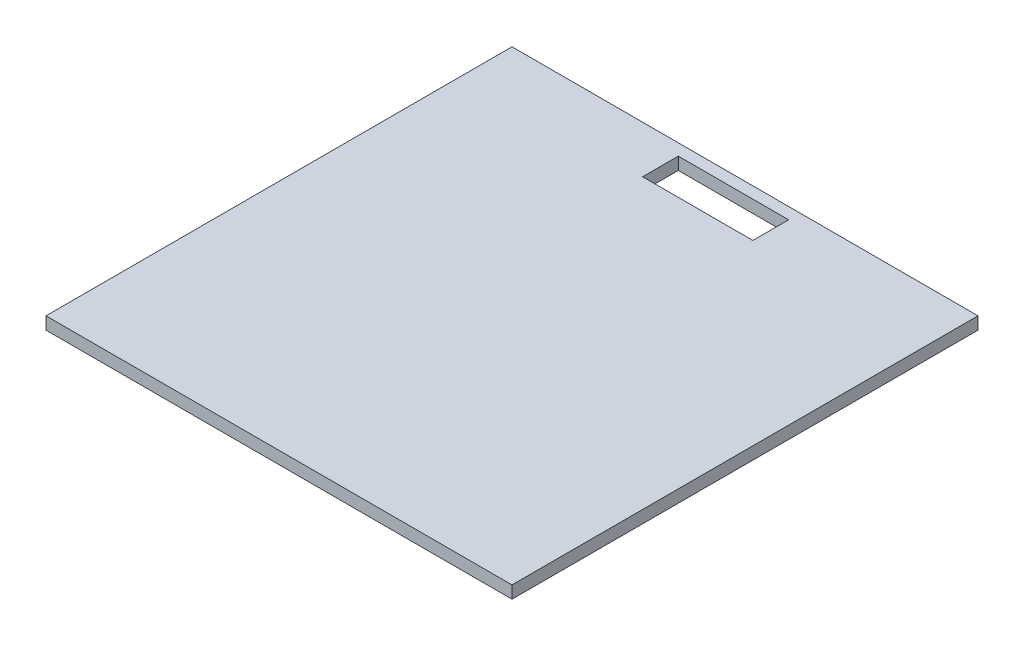
ISO-10303-21;
HEADER;
FILE_DESCRIPTION(('STEP AP214'),'2;1');
FILE_NAME('part.step','',(''),(''),'','','');
FILE_SCHEMA(('AUTOMOTIVE_DESIGN { 1 0 10303 214 1 1 1 1 }'));
ENDSEC;
DATA;
#1=APPLICATION_CONTEXT('core data for automotive mechanical design processes');
#2=APPLICATION_PROTOCOL_DEFINITION('international standard','automotive_design',2000,#1);
#3=PRODUCT_CONTEXT('',#1,'mechanical');
#4=PRODUCT('Part','Part','',(#3));
#5=PRODUCT_RELATED_PRODUCT_CATEGORY('part','',(#4));
#6=PRODUCT_DEFINITION_FORMATION('','',#4);
#7=PRODUCT_DEFINITION_CONTEXT('part definition',#1,'design');
#8=PRODUCT_DEFINITION('design','',#6,#7);
#9=PRODUCT_DEFINITION_SHAPE('','',#8);
#10=(LENGTH_UNIT() NAMED_UNIT(*) SI_UNIT(.MILLI.,.METRE.));
#11=(NAMED_UNIT(*) PLANE_ANGLE_UNIT() SI_UNIT($,.RADIAN.));
#12=(NAMED_UNIT(*) SI_UNIT($,.STERADIAN.) SOLID_ANGLE_UNIT());
#13=UNCERTAINTY_MEASURE_WITH_UNIT(LENGTH_MEASURE(1.E-05),#10,'distance_accuracy_value','');
#14=(GEOMETRIC_REPRESENTATION_CONTEXT(3) GLOBAL_UNCERTAINTY_ASSIGNED_CONTEXT((#13)) GLOBAL_UNIT_ASSIGNED_CONTEXT((#10,
#11,#12)) REPRESENTATION_CONTEXT('',''));
#15=CARTESIAN_POINT('',(0.,0.,0.));
#16=DIRECTION('',(0.,0.,1.));
#17=DIRECTION('',(1.,0.,0.));
#18=AXIS2_PLACEMENT_3D('',#15,#16,#17);
#19=CARTESIAN_POINT('',(0.,0.,0.));
#20=DIRECTION('',(0.,1.,0.));
#21=DIRECTION('',(0.,0.,1.));
#22=AXIS2_PLACEMENT_3D('',#19,#20,#21);
#23=PLANE('',#22);
#24=DIRECTION('',(0.,0.,-1.));
#25=VECTOR('',#24,1.);
#26=CARTESIAN_POINT('',(150.,0.,-150.));
#27=LINE('',#26,#25);
#28=CARTESIAN_POINT('',(150.,0.,150.));
#29=VERTEX_POINT('',#28);
#30=CARTESIAN_POINT('',(150.,0.,-150.));
#31=VERTEX_POINT('',#30);
#32=EDGE_CURVE('E125',#29,#31,#27,.T.);
#33=ORIENTED_EDGE('',*,*,#32,.F.);
#34=DIRECTION('',(1.,0.,0.));
#35=VECTOR('',#34,1.);
#36=CARTESIAN_POINT('',(-150.,0.,150.));
#37=LINE('',#36,#35);
#38=CARTESIAN_POINT('',(-150.,0.,150.));
#39=VERTEX_POINT('',#38);
#40=EDGE_CURVE('E73',#39,#29,#37,.T.);
#41=ORIENTED_EDGE('',*,*,#40,.F.);
#42=DIRECTION('',(0.,0.,1.));
#43=VECTOR('',#42,1.);
#44=CARTESIAN_POINT('',(-150.,0.,-150.));
#45=LINE('',#44,#43);
#46=CARTESIAN_POINT('',(-150.,0.,-150.));
#47=VERTEX_POINT('',#46);
#48=EDGE_CURVE('E175',#47,#39,#45,.T.);
#49=ORIENTED_EDGE('',*,*,#48,.F.);
#50=DIRECTION('',(-1.,0.,0.));
#51=VECTOR('',#50,1.);
#52=CARTESIAN_POINT('',(-150.,0.,-150.));
#53=LINE('',#52,#51);
#54=EDGE_CURVE('E180',#31,#47,#53,.T.);
#55=ORIENTED_EDGE('',*,*,#54,.F.);
#56=EDGE_LOOP('',(#33,#41,#49,#55));
#57=FACE_BOUND('',#56,.T.);
#58=DIRECTION('',(0.,0.,-1.));
#59=VECTOR('',#58,1.);
#60=CARTESIAN_POINT('',(35.5000000000001,0.,-142.565800102706));
#61=LINE('',#60,#59);
#62=CARTESIAN_POINT('',(35.5000000000001,0.,-119.565800102706));
#63=VERTEX_POINT('',#62);
#64=CARTESIAN_POINT('',(35.5000000000001,0.,-142.565800102706));
#65=VERTEX_POINT('',#64);
#66=EDGE_CURVE('E65',#63,#65,#61,.T.);
#67=ORIENTED_EDGE('',*,*,#66,.T.);
#68=DIRECTION('',(-1.,0.,0.));
#69=VECTOR('',#68,1.);
#70=CARTESIAN_POINT('',(-35.4999999999999,0.,-142.565800102706));
#71=LINE('',#70,#69);
#72=CARTESIAN_POINT('',(-35.4999999999999,0.,-142.565800102706));
#73=VERTEX_POINT('',#72);
#74=EDGE_CURVE('E123',#65,#73,#71,.T.);
#75=ORIENTED_EDGE('',*,*,#74,.T.);
#76=DIRECTION('',(0.,0.,1.));
#77=VECTOR('',#76,1.);
#78=CARTESIAN_POINT('',(-35.4999999999999,0.,-142.565800102706));
#79=LINE('',#78,#77);
#80=CARTESIAN_POINT('',(-35.4999999999999,0.,-119.565800102706));
#81=VERTEX_POINT('',#80);
#82=EDGE_CURVE('E216',#73,#81,#79,.T.);
#83=ORIENTED_EDGE('',*,*,#82,.T.);
#84=DIRECTION('',(1.,0.,0.));
#85=VECTOR('',#84,1.);
#86=CARTESIAN_POINT('',(-35.4999999999999,0.,-119.565800102706));
#87=LINE('',#86,#85);
#88=EDGE_CURVE('E212',#81,#63,#87,.T.);
#89=ORIENTED_EDGE('',*,*,#88,.T.);
#90=EDGE_LOOP('',(#67,#75,#83,#89));
#91=FACE_BOUND('',#90,.T.);
#92=ADVANCED_FACE('F49',(#57,#91),#23,.F.);
#93=CARTESIAN_POINT('',(150.,0.2,-150.));
#94=DIRECTION('',(-1.,0.,0.));
#95=DIRECTION('',(0.,0.,1.));
#96=AXIS2_PLACEMENT_3D('',#93,#94,#95);
#97=PLANE('',#96);
#98=ORIENTED_EDGE('',*,*,#32,.T.);
#99=DIRECTION('',(0.,-1.,0.));
#100=VECTOR('',#99,1.);
#101=CARTESIAN_POINT('',(150.,0.2,-150.));
#102=LINE('',#101,#100);
#103=CARTESIAN_POINT('',(150.,8.,-150.));
#104=VERTEX_POINT('',#103);
#105=EDGE_CURVE('E12',#104,#31,#102,.T.);
#106=ORIENTED_EDGE('',*,*,#105,.F.);
#107=DIRECTION('',(0.,0.,-1.));
#108=VECTOR('',#107,1.);
#109=CARTESIAN_POINT('',(150.,8.,-150.));
#110=LINE('',#109,#108);
#111=CARTESIAN_POINT('',(150.,8.,150.));
#112=VERTEX_POINT('',#111);
#113=EDGE_CURVE('E161',#112,#104,#110,.T.);
#114=ORIENTED_EDGE('',*,*,#113,.F.);
#115=DIRECTION('',(0.,-1.,0.));
#116=VECTOR('',#115,1.);
#117=CARTESIAN_POINT('',(150.,0.2,150.));
#118=LINE('',#117,#116);
#119=EDGE_CURVE('E183',#112,#29,#118,.T.);
#120=ORIENTED_EDGE('',*,*,#119,.T.);
#121=EDGE_LOOP('',(#98,#106,#114,#120));
#122=FACE_BOUND('',#121,.T.);
#123=ADVANCED_FACE('F51',(#122),#97,.F.);
#124=CARTESIAN_POINT('',(-150.,0.2,-150.));
#125=DIRECTION('',(0.,0.,1.));
#126=DIRECTION('',(1.,0.,0.));
#127=AXIS2_PLACEMENT_3D('',#124,#125,#126);
#128=PLANE('',#127);
#129=ORIENTED_EDGE('',*,*,#54,.T.);
#130=DIRECTION('',(0.,-1.,0.));
#131=VECTOR('',#130,1.);
#132=CARTESIAN_POINT('',(-150.,0.2,-150.));
#133=LINE('',#132,#131);
#134=CARTESIAN_POINT('',(-150.,8.,-150.));
#135=VERTEX_POINT('',#134);
#136=EDGE_CURVE('E58',#135,#47,#133,.T.);
#137=ORIENTED_EDGE('',*,*,#136,.F.);
#138=DIRECTION('',(-1.,0.,0.));
#139=VECTOR('',#138,1.);
#140=CARTESIAN_POINT('',(-150.,8.,-150.));
#141=LINE('',#140,#139);
#142=EDGE_CURVE('E154',#104,#135,#141,.T.);
#143=ORIENTED_EDGE('',*,*,#142,.F.);
#144=ORIENTED_EDGE('',*,*,#105,.T.);
#145=EDGE_LOOP('',(#129,#137,#143,#144));
#146=FACE_BOUND('',#145,.T.);
#147=ADVANCED_FACE('F242',(#146),#128,.F.);
#148=CARTESIAN_POINT('',(-150.,0.2,-150.));
#149=DIRECTION('',(1.,0.,0.));
#150=DIRECTION('',(0.,0.,-1.));
#151=AXIS2_PLACEMENT_3D('',#148,#149,#150);
#152=PLANE('',#151);
#153=ORIENTED_EDGE('',*,*,#48,.T.);
#154=DIRECTION('',(0.,-1.,0.));
#155=VECTOR('',#154,1.);
#156=CARTESIAN_POINT('',(-150.,0.2,150.));
#157=LINE('',#156,#155);
#158=CARTESIAN_POINT('',(-150.,8.,150.));
#159=VERTEX_POINT('',#158);
#160=EDGE_CURVE('E186',#159,#39,#157,.T.);
#161=ORIENTED_EDGE('',*,*,#160,.F.);
#162=DIRECTION('',(0.,0.,1.));
#163=VECTOR('',#162,1.);
#164=CARTESIAN_POINT('',(-150.,8.,-150.));
#165=LINE('',#164,#163);
#166=EDGE_CURVE('E160',#135,#159,#165,.T.);
#167=ORIENTED_EDGE('',*,*,#166,.F.);
#168=ORIENTED_EDGE('',*,*,#136,.T.);
#169=EDGE_LOOP('',(#153,#161,#167,#168));
#170=FACE_BOUND('',#169,.T.);
#171=ADVANCED_FACE('F193',(#170),#152,.F.);
#172=CARTESIAN_POINT('',(-150.,0.2,150.));
#173=DIRECTION('',(0.,0.,-1.));
#174=DIRECTION('',(-1.,0.,0.));
#175=AXIS2_PLACEMENT_3D('',#172,#173,#174);
#176=PLANE('',#175);
#177=ORIENTED_EDGE('',*,*,#40,.T.);
#178=ORIENTED_EDGE('',*,*,#119,.F.);
#179=DIRECTION('',(1.,0.,0.));
#180=VECTOR('',#179,1.);
#181=CARTESIAN_POINT('',(-150.,8.,150.));
#182=LINE('',#181,#180);
#183=EDGE_CURVE('E166',#159,#112,#182,.T.);
#184=ORIENTED_EDGE('',*,*,#183,.F.);
#185=ORIENTED_EDGE('',*,*,#160,.T.);
#186=EDGE_LOOP('',(#177,#178,#184,#185));
#187=FACE_BOUND('',#186,.T.);
#188=ADVANCED_FACE('F246',(#187),#176,.F.);
#189=CARTESIAN_POINT('',(35.5000000000001,0.2,-142.565800102706));
#190=DIRECTION('',(-1.,0.,0.));
#191=DIRECTION('',(0.,0.,1.));
#192=AXIS2_PLACEMENT_3D('',#189,#190,#191);
#193=PLANE('',#192);
#194=ORIENTED_EDGE('',*,*,#66,.F.);
#195=DIRECTION('',(0.,-1.,0.));
#196=VECTOR('',#195,1.);
#197=CARTESIAN_POINT('',(35.5000000000001,0.2,-119.565800102706));
#198=LINE('',#197,#196);
#199=CARTESIAN_POINT('',(35.5000000000001,8.,-119.565800102706));
#200=VERTEX_POINT('',#199);
#201=EDGE_CURVE('E131',#200,#63,#198,.T.);
#202=ORIENTED_EDGE('',*,*,#201,.F.);
#203=DIRECTION('',(0.,0.,-1.));
#204=VECTOR('',#203,1.);
#205=CARTESIAN_POINT('',(35.5000000000001,8.,-142.565800102706));
#206=LINE('',#205,#204);
#207=CARTESIAN_POINT('',(35.5000000000001,8.,-142.565800102706));
#208=VERTEX_POINT('',#207);
#209=EDGE_CURVE('E129',#200,#208,#206,.T.);
#210=ORIENTED_EDGE('',*,*,#209,.T.);
#211=DIRECTION('',(0.,-1.,0.));
#212=VECTOR('',#211,1.);
#213=CARTESIAN_POINT('',(35.5000000000001,0.2,-142.565800102706));
#214=LINE('',#213,#212);
#215=EDGE_CURVE('E116',#208,#65,#214,.T.);
#216=ORIENTED_EDGE('',*,*,#215,.T.);
#217=EDGE_LOOP('',(#194,#202,#210,#216));
#218=FACE_BOUND('',#217,.T.);
#219=ADVANCED_FACE('F130',(#218),#193,.T.);
#220=CARTESIAN_POINT('',(-35.4999999999999,0.2,-142.565800102706));
#221=DIRECTION('',(0.,0.,1.));
#222=DIRECTION('',(1.,0.,0.));
#223=AXIS2_PLACEMENT_3D('',#220,#221,#222);
#224=PLANE('',#223);
#225=ORIENTED_EDGE('',*,*,#74,.F.);
#226=ORIENTED_EDGE('',*,*,#215,.F.);
#227=DIRECTION('',(-1.,0.,0.));
#228=VECTOR('',#227,1.);
#229=CARTESIAN_POINT('',(-35.4999999999999,8.,-142.565800102706));
#230=LINE('',#229,#228);
#231=CARTESIAN_POINT('',(-35.4999999999999,8.,-142.565800102706));
#232=VERTEX_POINT('',#231);
#233=EDGE_CURVE('E120',#208,#232,#230,.T.);
#234=ORIENTED_EDGE('',*,*,#233,.T.);
#235=DIRECTION('',(0.,-1.,0.));
#236=VECTOR('',#235,1.);
#237=CARTESIAN_POINT('',(-35.4999999999999,0.2,-142.565800102706));
#238=LINE('',#237,#236);
#239=EDGE_CURVE('E126',#232,#73,#238,.T.);
#240=ORIENTED_EDGE('',*,*,#239,.T.);
#241=EDGE_LOOP('',(#225,#226,#234,#240));
#242=FACE_BOUND('',#241,.T.);
#243=ADVANCED_FACE('F118',(#242),#224,.T.);
#244=CARTESIAN_POINT('',(-35.4999999999999,0.2,-142.565800102706));
#245=DIRECTION('',(1.,0.,0.));
#246=DIRECTION('',(0.,0.,-1.));
#247=AXIS2_PLACEMENT_3D('',#244,#245,#246);
#248=PLANE('',#247);
#249=ORIENTED_EDGE('',*,*,#82,.F.);
#250=ORIENTED_EDGE('',*,*,#239,.F.);
#251=DIRECTION('',(0.,0.,1.));
#252=VECTOR('',#251,1.);
#253=CARTESIAN_POINT('',(-35.4999999999999,8.,-142.565800102706));
#254=LINE('',#253,#252);
#255=CARTESIAN_POINT('',(-35.4999999999999,8.,-119.565800102706));
#256=VERTEX_POINT('',#255);
#257=EDGE_CURVE('E139',#232,#256,#254,.T.);
#258=ORIENTED_EDGE('',*,*,#257,.T.);
#259=DIRECTION('',(0.,-1.,0.));
#260=VECTOR('',#259,1.);
#261=CARTESIAN_POINT('',(-35.4999999999999,0.2,-119.565800102706));
#262=LINE('',#261,#260);
#263=EDGE_CURVE('E207',#256,#81,#262,.T.);
#264=ORIENTED_EDGE('',*,*,#263,.T.);
#265=EDGE_LOOP('',(#249,#250,#258,#264));
#266=FACE_BOUND('',#265,.T.);
#267=ADVANCED_FACE('F236',(#266),#248,.T.);
#268=CARTESIAN_POINT('',(-35.4999999999999,0.2,-119.565800102706));
#269=DIRECTION('',(0.,0.,-1.));
#270=DIRECTION('',(-1.,0.,0.));
#271=AXIS2_PLACEMENT_3D('',#268,#269,#270);
#272=PLANE('',#271);
#273=ORIENTED_EDGE('',*,*,#88,.F.);
#274=ORIENTED_EDGE('',*,*,#263,.F.);
#275=DIRECTION('',(1.,0.,0.));
#276=VECTOR('',#275,1.);
#277=CARTESIAN_POINT('',(-35.4999999999999,8.,-119.565800102706));
#278=LINE('',#277,#276);
#279=EDGE_CURVE('E143',#256,#200,#278,.T.);
#280=ORIENTED_EDGE('',*,*,#279,.T.);
#281=ORIENTED_EDGE('',*,*,#201,.T.);
#282=EDGE_LOOP('',(#273,#274,#280,#281));
#283=FACE_BOUND('',#282,.T.);
#284=ADVANCED_FACE('F233',(#283),#272,.T.);
#285=CARTESIAN_POINT('',(0.,8.,0.));
#286=DIRECTION('',(0.,1.,0.));
#287=DIRECTION('',(0.,0.,1.));
#288=AXIS2_PLACEMENT_3D('',#285,#286,#287);
#289=PLANE('',#288);
#290=ORIENTED_EDGE('',*,*,#113,.T.);
#291=ORIENTED_EDGE('',*,*,#142,.T.);
#292=ORIENTED_EDGE('',*,*,#166,.T.);
#293=ORIENTED_EDGE('',*,*,#183,.T.);
#294=EDGE_LOOP('',(#290,#291,#292,#293));
#295=FACE_BOUND('',#294,.T.);
#296=ORIENTED_EDGE('',*,*,#233,.F.);
#297=ORIENTED_EDGE('',*,*,#209,.F.);
#298=ORIENTED_EDGE('',*,*,#279,.F.);
#299=ORIENTED_EDGE('',*,*,#257,.F.);
#300=EDGE_LOOP('',(#296,#297,#298,#299));
#301=FACE_BOUND('',#300,.T.);
#302=ADVANCED_FACE('F137',(#295,#301),#289,.T.);
#303=CLOSED_SHELL('',(#92,#123,#147,#171,#188,#219,#243,#267,#284,#302));
#304=MANIFOLD_SOLID_BREP('B2',#303);
#305=ADVANCED_BREP_SHAPE_REPRESENTATION('',(#18,#304),#14);
#306=SHAPE_DEFINITION_REPRESENTATION(#9,#305);
ENDSEC;
END-ISO-10303-21;
